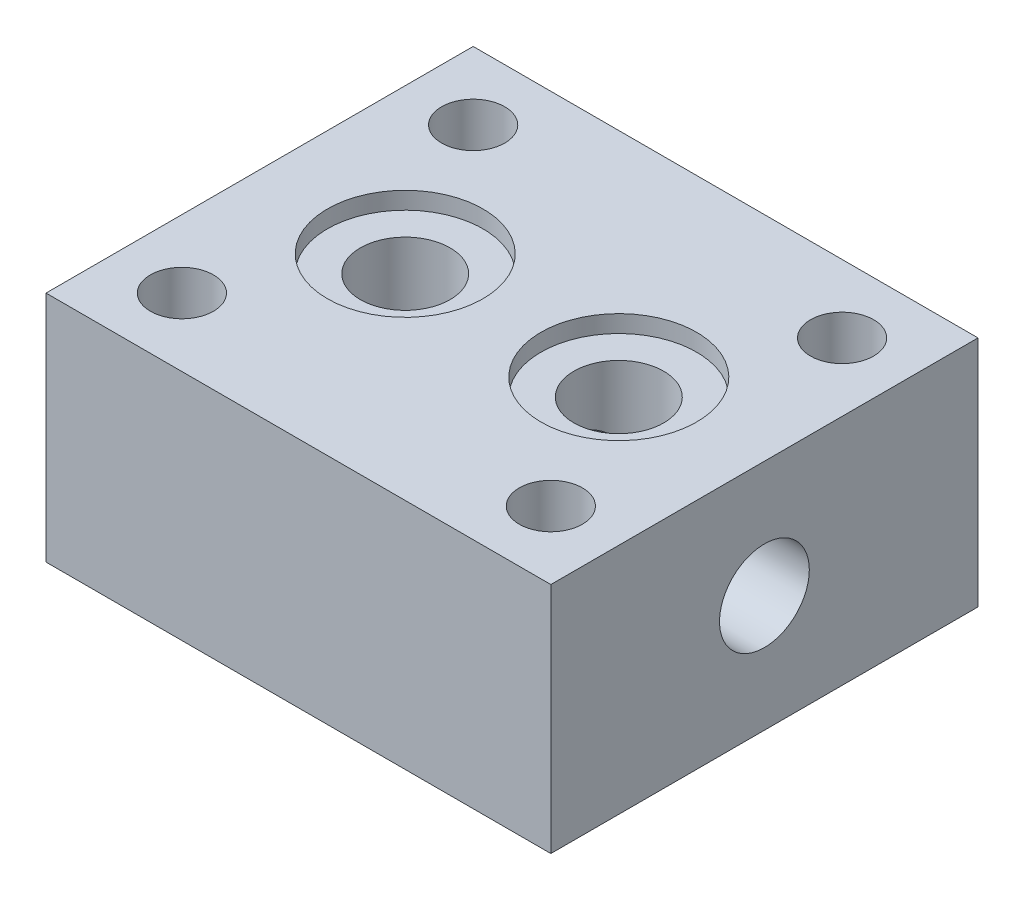
ISO-10303-21;
HEADER;
FILE_DESCRIPTION(('STEP AP214'),'2;1');
FILE_NAME('part.step','',(''),(''),'','','');
FILE_SCHEMA(('AUTOMOTIVE_DESIGN { 1 0 10303 214 1 1 1 1 }'));
ENDSEC;
DATA;
#1=APPLICATION_CONTEXT('core data for automotive mechanical design processes');
#2=APPLICATION_PROTOCOL_DEFINITION('international standard','automotive_design',2000,#1);
#3=PRODUCT_CONTEXT('',#1,'mechanical');
#4=PRODUCT('Part','Part','',(#3));
#5=PRODUCT_RELATED_PRODUCT_CATEGORY('part','',(#4));
#6=PRODUCT_DEFINITION_FORMATION('','',#4);
#7=PRODUCT_DEFINITION_CONTEXT('part definition',#1,'design');
#8=PRODUCT_DEFINITION('design','',#6,#7);
#9=PRODUCT_DEFINITION_SHAPE('','',#8);
#10=(LENGTH_UNIT() NAMED_UNIT(*) SI_UNIT(.MILLI.,.METRE.));
#11=(NAMED_UNIT(*) PLANE_ANGLE_UNIT() SI_UNIT($,.RADIAN.));
#12=(NAMED_UNIT(*) SI_UNIT($,.STERADIAN.) SOLID_ANGLE_UNIT());
#13=UNCERTAINTY_MEASURE_WITH_UNIT(LENGTH_MEASURE(1.E-05),#10,'distance_accuracy_value','');
#14=(GEOMETRIC_REPRESENTATION_CONTEXT(3) GLOBAL_UNCERTAINTY_ASSIGNED_CONTEXT((#13)) GLOBAL_UNIT_ASSIGNED_CONTEXT((#10,
#11,#12)) REPRESENTATION_CONTEXT('',''));
#15=CARTESIAN_POINT('',(0.,0.,0.));
#16=DIRECTION('',(0.,0.,1.));
#17=DIRECTION('',(1.,0.,0.));
#18=AXIS2_PLACEMENT_3D('',#15,#16,#17);
#19=CARTESIAN_POINT('',(17.4625,-9.525,0.));
#20=DIRECTION('',(0.,1.,0.));
#21=DIRECTION('',(0.,0.,1.));
#22=AXIS2_PLACEMENT_3D('',#19,#20,#21);
#23=CYLINDRICAL_SURFACE('',#22,7.3421875);
#24=CARTESIAN_POINT('',(17.4625,16.2306,0.));
#25=DIRECTION('',(0.,1.,0.));
#26=DIRECTION('',(0.,0.,1.));
#27=AXIS2_PLACEMENT_3D('',#24,#25,#26);
#28=CIRCLE('',#27,7.3421875);
#29=CARTESIAN_POINT('',(17.4625,16.2306,7.3421875));
#30=VERTEX_POINT('',#29);
#31=EDGE_CURVE('E151',#30,#30,#28,.F.);
#32=ORIENTED_EDGE('',*,*,#31,.F.);
#33=EDGE_LOOP('',(#32));
#34=FACE_BOUND('',#33,.T.);
#35=CARTESIAN_POINT('',(17.4625,0.,0.));
#36=DIRECTION('',(-0.707106781186547,0.707106781186548,0.));
#37=DIRECTION('',(0.707106781186547,0.707106781186548,0.));
#38=AXIS2_PLACEMENT_3D('',#35,#36,#37);
#39=ELLIPSE('',#38,10.3834211399862,7.3421875);
#40=CARTESIAN_POINT('',(17.4625,0.,-7.3421875));
#41=VERTEX_POINT('',#40);
#42=CARTESIAN_POINT('',(17.4625,0.,7.3421875));
#43=VERTEX_POINT('',#42);
#44=EDGE_CURVE('E63',#41,#43,#39,.F.);
#45=ORIENTED_EDGE('',*,*,#44,.T.);
#46=CARTESIAN_POINT('',(17.4625,0.,0.));
#47=DIRECTION('',(0.707106781186547,0.707106781186548,0.));
#48=DIRECTION('',(-0.707106781186547,0.707106781186548,0.));
#49=AXIS2_PLACEMENT_3D('',#46,#47,#48);
#50=ELLIPSE('',#49,10.3834211399862,7.3421875);
#51=EDGE_CURVE('E216',#43,#41,#50,.F.);
#52=ORIENTED_EDGE('',*,*,#51,.T.);
#53=EDGE_LOOP('',(#45,#52));
#54=FACE_BOUND('',#53,.T.);
#55=ADVANCED_FACE('F41',(#34,#54),#23,.F.);
#56=CARTESIAN_POINT('',(41.275,19.05,34.925));
#57=DIRECTION('',(-1.,0.,0.));
#58=DIRECTION('',(0.,0.,1.));
#59=AXIS2_PLACEMENT_3D('',#56,#57,#58);
#60=PLANE('',#59);
#61=CARTESIAN_POINT('',(41.275,0.,0.));
#62=DIRECTION('',(1.,0.,0.));
#63=DIRECTION('',(0.,0.,-1.));
#64=AXIS2_PLACEMENT_3D('',#61,#62,#63);
#65=CIRCLE('',#64,7.3421875);
#66=CARTESIAN_POINT('',(41.275,0.,-7.3421875));
#67=VERTEX_POINT('',#66);
#68=EDGE_CURVE('E119',#67,#67,#65,.T.);
#69=ORIENTED_EDGE('',*,*,#68,.F.);
#70=EDGE_LOOP('',(#69));
#71=FACE_BOUND('',#70,.T.);
#72=DIRECTION('',(0.,0.,-1.));
#73=VECTOR('',#72,1.);
#74=CARTESIAN_POINT('',(41.275,-19.05,34.925));
#75=LINE('',#74,#73);
#76=CARTESIAN_POINT('',(41.275,-19.05,34.925));
#77=VERTEX_POINT('',#76);
#78=CARTESIAN_POINT('',(41.275,-19.05,-34.925));
#79=VERTEX_POINT('',#78);
#80=EDGE_CURVE('E173',#77,#79,#75,.T.);
#81=ORIENTED_EDGE('',*,*,#80,.T.);
#82=DIRECTION('',(0.,-1.,0.));
#83=VECTOR('',#82,1.);
#84=CARTESIAN_POINT('',(41.275,19.05,-34.925));
#85=LINE('',#84,#83);
#86=CARTESIAN_POINT('',(41.275,19.05,-34.925));
#87=VERTEX_POINT('',#86);
#88=EDGE_CURVE('E202',#87,#79,#85,.T.);
#89=ORIENTED_EDGE('',*,*,#88,.F.);
#90=DIRECTION('',(0.,0.,-1.));
#91=VECTOR('',#90,1.);
#92=CARTESIAN_POINT('',(41.275,19.05,34.925));
#93=LINE('',#92,#91);
#94=CARTESIAN_POINT('',(41.275,19.05,34.925));
#95=VERTEX_POINT('',#94);
#96=EDGE_CURVE('E176',#95,#87,#93,.T.);
#97=ORIENTED_EDGE('',*,*,#96,.F.);
#98=DIRECTION('',(0.,-1.,0.));
#99=VECTOR('',#98,1.);
#100=CARTESIAN_POINT('',(41.275,19.05,34.925));
#101=LINE('',#100,#99);
#102=EDGE_CURVE('E186',#95,#77,#101,.T.);
#103=ORIENTED_EDGE('',*,*,#102,.T.);
#104=EDGE_LOOP('',(#81,#89,#97,#103));
#105=FACE_BOUND('',#104,.T.);
#106=ADVANCED_FACE('F43',(#71,#105),#60,.F.);
#107=CARTESIAN_POINT('',(-41.275,19.05,-34.925));
#108=DIRECTION('',(0.,0.,1.));
#109=DIRECTION('',(1.,0.,0.));
#110=AXIS2_PLACEMENT_3D('',#107,#108,#109);
#111=PLANE('',#110);
#112=DIRECTION('',(-1.,0.,0.));
#113=VECTOR('',#112,1.);
#114=CARTESIAN_POINT('',(-41.275,-19.05,-34.925));
#115=LINE('',#114,#113);
#116=CARTESIAN_POINT('',(-41.275,-19.05,-34.925));
#117=VERTEX_POINT('',#116);
#118=EDGE_CURVE('E189',#79,#117,#115,.T.);
#119=ORIENTED_EDGE('',*,*,#118,.T.);
#120=DIRECTION('',(0.,-1.,0.));
#121=VECTOR('',#120,1.);
#122=CARTESIAN_POINT('',(-41.275,19.05,-34.925));
#123=LINE('',#122,#121);
#124=CARTESIAN_POINT('',(-41.275,19.05,-34.925));
#125=VERTEX_POINT('',#124);
#126=EDGE_CURVE('E199',#125,#117,#123,.T.);
#127=ORIENTED_EDGE('',*,*,#126,.F.);
#128=DIRECTION('',(-1.,0.,0.));
#129=VECTOR('',#128,1.);
#130=CARTESIAN_POINT('',(-41.275,19.05,-34.925));
#131=LINE('',#130,#129);
#132=EDGE_CURVE('E179',#87,#125,#131,.T.);
#133=ORIENTED_EDGE('',*,*,#132,.F.);
#134=ORIENTED_EDGE('',*,*,#88,.T.);
#135=EDGE_LOOP('',(#119,#127,#133,#134));
#136=FACE_BOUND('',#135,.T.);
#137=ADVANCED_FACE('F251',(#136),#111,.F.);
#138=CARTESIAN_POINT('',(-41.275,19.05,34.925));
#139=DIRECTION('',(1.,0.,0.));
#140=DIRECTION('',(0.,0.,-1.));
#141=AXIS2_PLACEMENT_3D('',#138,#139,#140);
#142=PLANE('',#141);
#143=DIRECTION('',(0.,0.,1.));
#144=VECTOR('',#143,1.);
#145=CARTESIAN_POINT('',(-41.275,-19.05,34.925));
#146=LINE('',#145,#144);
#147=CARTESIAN_POINT('',(-41.275,-19.05,34.925));
#148=VERTEX_POINT('',#147);
#149=EDGE_CURVE('E191',#117,#148,#146,.T.);
#150=ORIENTED_EDGE('',*,*,#149,.T.);
#151=DIRECTION('',(0.,-1.,0.));
#152=VECTOR('',#151,1.);
#153=CARTESIAN_POINT('',(-41.275,19.05,34.925));
#154=LINE('',#153,#152);
#155=CARTESIAN_POINT('',(-41.275,19.05,34.925));
#156=VERTEX_POINT('',#155);
#157=EDGE_CURVE('E196',#156,#148,#154,.T.);
#158=ORIENTED_EDGE('',*,*,#157,.F.);
#159=DIRECTION('',(0.,0.,1.));
#160=VECTOR('',#159,1.);
#161=CARTESIAN_POINT('',(-41.275,19.05,34.925));
#162=LINE('',#161,#160);
#163=EDGE_CURVE('E182',#125,#156,#162,.T.);
#164=ORIENTED_EDGE('',*,*,#163,.F.);
#165=ORIENTED_EDGE('',*,*,#126,.T.);
#166=EDGE_LOOP('',(#150,#158,#164,#165));
#167=FACE_BOUND('',#166,.T.);
#168=ADVANCED_FACE('F288',(#167),#142,.F.);
#169=CARTESIAN_POINT('',(-41.275,19.05,34.925));
#170=DIRECTION('',(0.,0.,-1.));
#171=DIRECTION('',(-1.,0.,0.));
#172=AXIS2_PLACEMENT_3D('',#169,#170,#171);
#173=PLANE('',#172);
#174=DIRECTION('',(1.,0.,0.));
#175=VECTOR('',#174,1.);
#176=CARTESIAN_POINT('',(-41.275,-19.05,34.925));
#177=LINE('',#176,#175);
#178=EDGE_CURVE('E180',#148,#77,#177,.T.);
#179=ORIENTED_EDGE('',*,*,#178,.T.);
#180=ORIENTED_EDGE('',*,*,#102,.F.);
#181=DIRECTION('',(1.,0.,0.));
#182=VECTOR('',#181,1.);
#183=CARTESIAN_POINT('',(-41.275,19.05,34.925));
#184=LINE('',#183,#182);
#185=EDGE_CURVE('E184',#156,#95,#184,.T.);
#186=ORIENTED_EDGE('',*,*,#185,.F.);
#187=ORIENTED_EDGE('',*,*,#157,.T.);
#188=EDGE_LOOP('',(#179,#180,#186,#187));
#189=FACE_BOUND('',#188,.T.);
#190=ADVANCED_FACE('F281',(#189),#173,.F.);
#191=CARTESIAN_POINT('',(0.,19.05,0.));
#192=DIRECTION('',(0.,-1.,0.));
#193=DIRECTION('',(0.,0.,-1.));
#194=AXIS2_PLACEMENT_3D('',#191,#192,#193);
#195=PLANE('',#194);
#196=CARTESIAN_POINT('',(-17.4625,19.05,0.));
#197=DIRECTION('',(0.,1.,0.));
#198=DIRECTION('',(0.,0.,1.));
#199=AXIS2_PLACEMENT_3D('',#196,#197,#198);
#200=CIRCLE('',#199,12.7254);
#201=CARTESIAN_POINT('',(-17.4625,19.05,12.7254));
#202=VERTEX_POINT('',#201);
#203=EDGE_CURVE('E135',#202,#202,#200,.T.);
#204=ORIENTED_EDGE('',*,*,#203,.F.);
#205=EDGE_LOOP('',(#204));
#206=FACE_BOUND('',#205,.T.);
#207=CARTESIAN_POINT('',(17.4625,19.05,0.));
#208=DIRECTION('',(0.,1.,0.));
#209=DIRECTION('',(0.,0.,1.));
#210=AXIS2_PLACEMENT_3D('',#207,#208,#209);
#211=CIRCLE('',#210,12.7254);
#212=CARTESIAN_POINT('',(17.4625,19.05,12.7254));
#213=VERTEX_POINT('',#212);
#214=EDGE_CURVE('E138',#213,#213,#211,.T.);
#215=ORIENTED_EDGE('',*,*,#214,.F.);
#216=EDGE_LOOP('',(#215));
#217=FACE_BOUND('',#216,.T.);
#218=CARTESIAN_POINT('',(30.1625,19.05,23.8125));
#219=DIRECTION('',(0.,1.,0.));
#220=DIRECTION('',(0.,0.,1.));
#221=AXIS2_PLACEMENT_3D('',#218,#219,#220);
#222=CIRCLE('',#221,5.159375);
#223=CARTESIAN_POINT('',(30.1625,19.05,28.971875));
#224=VERTEX_POINT('',#223);
#225=EDGE_CURVE('E158',#224,#224,#222,.T.);
#226=ORIENTED_EDGE('',*,*,#225,.F.);
#227=EDGE_LOOP('',(#226));
#228=FACE_BOUND('',#227,.T.);
#229=CARTESIAN_POINT('',(-30.1625,19.05,-23.8125));
#230=DIRECTION('',(0.,1.,0.));
#231=DIRECTION('',(0.,0.,1.));
#232=AXIS2_PLACEMENT_3D('',#229,#230,#231);
#233=CIRCLE('',#232,5.159375);
#234=CARTESIAN_POINT('',(-30.1625,19.05,-18.653125));
#235=VERTEX_POINT('',#234);
#236=EDGE_CURVE('E165',#235,#235,#233,.T.);
#237=ORIENTED_EDGE('',*,*,#236,.F.);
#238=EDGE_LOOP('',(#237));
#239=FACE_BOUND('',#238,.T.);
#240=CARTESIAN_POINT('',(30.1625,19.05,-23.8125));
#241=DIRECTION('',(0.,1.,0.));
#242=DIRECTION('',(0.,0.,1.));
#243=AXIS2_PLACEMENT_3D('',#240,#241,#242);
#244=CIRCLE('',#243,5.159375);
#245=CARTESIAN_POINT('',(30.1625,19.05,-18.653125));
#246=VERTEX_POINT('',#245);
#247=EDGE_CURVE('E152',#246,#246,#244,.T.);
#248=ORIENTED_EDGE('',*,*,#247,.F.);
#249=EDGE_LOOP('',(#248));
#250=FACE_BOUND('',#249,.T.);
#251=CARTESIAN_POINT('',(-30.1625,19.05,23.8125));
#252=DIRECTION('',(0.,1.,0.));
#253=DIRECTION('',(0.,0.,1.));
#254=AXIS2_PLACEMENT_3D('',#251,#252,#253);
#255=CIRCLE('',#254,5.159375);
#256=CARTESIAN_POINT('',(-30.1625,19.05,28.971875));
#257=VERTEX_POINT('',#256);
#258=EDGE_CURVE('E161',#257,#257,#255,.T.);
#259=ORIENTED_EDGE('',*,*,#258,.F.);
#260=EDGE_LOOP('',(#259));
#261=FACE_BOUND('',#260,.T.);
#262=ORIENTED_EDGE('',*,*,#96,.T.);
#263=ORIENTED_EDGE('',*,*,#132,.T.);
#264=ORIENTED_EDGE('',*,*,#163,.T.);
#265=ORIENTED_EDGE('',*,*,#185,.T.);
#266=EDGE_LOOP('',(#262,#263,#264,#265));
#267=FACE_BOUND('',#266,.T.);
#268=ADVANCED_FACE('F278',(#206,#217,#228,#239,#250,#261,#267),#195,.F.);
#269=CARTESIAN_POINT('',(0.,-19.05,0.));
#270=DIRECTION('',(0.,-1.,0.));
#271=DIRECTION('',(0.,0.,-1.));
#272=AXIS2_PLACEMENT_3D('',#269,#270,#271);
#273=PLANE('',#272);
#274=CARTESIAN_POINT('',(30.1625,-19.05,23.8125));
#275=DIRECTION('',(0.,1.,0.));
#276=DIRECTION('',(0.,0.,1.));
#277=AXIS2_PLACEMENT_3D('',#274,#275,#276);
#278=CIRCLE('',#277,5.159375);
#279=CARTESIAN_POINT('',(30.1625,-19.05,28.971875));
#280=VERTEX_POINT('',#279);
#281=EDGE_CURVE('E162',#280,#280,#278,.T.);
#282=ORIENTED_EDGE('',*,*,#281,.T.);
#283=EDGE_LOOP('',(#282));
#284=FACE_BOUND('',#283,.T.);
#285=CARTESIAN_POINT('',(-30.1625,-19.05,-23.8125));
#286=DIRECTION('',(0.,1.,0.));
#287=DIRECTION('',(0.,0.,1.));
#288=AXIS2_PLACEMENT_3D('',#285,#286,#287);
#289=CIRCLE('',#288,5.159375);
#290=CARTESIAN_POINT('',(-30.1625,-19.05,-18.653125));
#291=VERTEX_POINT('',#290);
#292=EDGE_CURVE('E155',#291,#291,#289,.T.);
#293=ORIENTED_EDGE('',*,*,#292,.T.);
#294=EDGE_LOOP('',(#293));
#295=FACE_BOUND('',#294,.T.);
#296=CARTESIAN_POINT('',(30.1625,-19.05,-23.8125));
#297=DIRECTION('',(0.,1.,0.));
#298=DIRECTION('',(0.,0.,1.));
#299=AXIS2_PLACEMENT_3D('',#296,#297,#298);
#300=CIRCLE('',#299,5.159375);
#301=CARTESIAN_POINT('',(30.1625,-19.05,-18.653125));
#302=VERTEX_POINT('',#301);
#303=EDGE_CURVE('E147',#302,#302,#300,.T.);
#304=ORIENTED_EDGE('',*,*,#303,.T.);
#305=EDGE_LOOP('',(#304));
#306=FACE_BOUND('',#305,.T.);
#307=CARTESIAN_POINT('',(-30.1625,-19.05,23.8125));
#308=DIRECTION('',(0.,1.,0.));
#309=DIRECTION('',(0.,0.,1.));
#310=AXIS2_PLACEMENT_3D('',#307,#308,#309);
#311=CIRCLE('',#310,5.159375);
#312=CARTESIAN_POINT('',(-30.1625,-19.05,28.971875));
#313=VERTEX_POINT('',#312);
#314=EDGE_CURVE('E170',#313,#313,#311,.T.);
#315=ORIENTED_EDGE('',*,*,#314,.T.);
#316=EDGE_LOOP('',(#315));
#317=FACE_BOUND('',#316,.T.);
#318=ORIENTED_EDGE('',*,*,#80,.F.);
#319=ORIENTED_EDGE('',*,*,#178,.F.);
#320=ORIENTED_EDGE('',*,*,#149,.F.);
#321=ORIENTED_EDGE('',*,*,#118,.F.);
#322=EDGE_LOOP('',(#318,#319,#320,#321));
#323=FACE_BOUND('',#322,.T.);
#324=ADVANCED_FACE('F276',(#284,#295,#306,#317,#323),#273,.T.);
#325=CARTESIAN_POINT('',(-30.1625,-19.05,23.8125));
#326=DIRECTION('',(0.,1.,0.));
#327=DIRECTION('',(0.,0.,1.));
#328=AXIS2_PLACEMENT_3D('',#325,#326,#327);
#329=CYLINDRICAL_SURFACE('',#328,5.159375);
#330=ORIENTED_EDGE('',*,*,#314,.F.);
#331=EDGE_LOOP('',(#330));
#332=FACE_BOUND('',#331,.T.);
#333=ORIENTED_EDGE('',*,*,#258,.T.);
#334=EDGE_LOOP('',(#333));
#335=FACE_BOUND('',#334,.T.);
#336=ADVANCED_FACE('F264',(#332,#335),#329,.F.);
#337=CARTESIAN_POINT('',(30.1625,-19.05,-23.8125));
#338=DIRECTION('',(0.,1.,0.));
#339=DIRECTION('',(0.,0.,1.));
#340=AXIS2_PLACEMENT_3D('',#337,#338,#339);
#341=CYLINDRICAL_SURFACE('',#340,5.159375);
#342=ORIENTED_EDGE('',*,*,#303,.F.);
#343=EDGE_LOOP('',(#342));
#344=FACE_BOUND('',#343,.T.);
#345=ORIENTED_EDGE('',*,*,#247,.T.);
#346=EDGE_LOOP('',(#345));
#347=FACE_BOUND('',#346,.T.);
#348=ADVANCED_FACE('F260',(#344,#347),#341,.F.);
#349=CARTESIAN_POINT('',(-30.1625,-19.05,-23.8125));
#350=DIRECTION('',(0.,1.,0.));
#351=DIRECTION('',(0.,0.,1.));
#352=AXIS2_PLACEMENT_3D('',#349,#350,#351);
#353=CYLINDRICAL_SURFACE('',#352,5.159375);
#354=ORIENTED_EDGE('',*,*,#292,.F.);
#355=EDGE_LOOP('',(#354));
#356=FACE_BOUND('',#355,.T.);
#357=ORIENTED_EDGE('',*,*,#236,.T.);
#358=EDGE_LOOP('',(#357));
#359=FACE_BOUND('',#358,.T.);
#360=ADVANCED_FACE('F263',(#356,#359),#353,.F.);
#361=CARTESIAN_POINT('',(30.1625,-19.05,23.8125));
#362=DIRECTION('',(0.,1.,0.));
#363=DIRECTION('',(0.,0.,1.));
#364=AXIS2_PLACEMENT_3D('',#361,#362,#363);
#365=CYLINDRICAL_SURFACE('',#364,5.159375);
#366=ORIENTED_EDGE('',*,*,#281,.F.);
#367=EDGE_LOOP('',(#366));
#368=FACE_BOUND('',#367,.T.);
#369=ORIENTED_EDGE('',*,*,#225,.T.);
#370=EDGE_LOOP('',(#369));
#371=FACE_BOUND('',#370,.T.);
#372=ADVANCED_FACE('F266',(#368,#371),#365,.F.);
#373=CARTESIAN_POINT('',(-17.4625,16.2306,0.));
#374=DIRECTION('',(0.,1.,0.));
#375=DIRECTION('',(0.,0.,1.));
#376=AXIS2_PLACEMENT_3D('',#373,#374,#375);
#377=PLANE('',#376);
#378=CARTESIAN_POINT('',(-17.4625,16.2306,0.));
#379=DIRECTION('',(0.,1.,0.));
#380=DIRECTION('',(0.,0.,1.));
#381=AXIS2_PLACEMENT_3D('',#378,#379,#380);
#382=CIRCLE('',#381,12.7254);
#383=CARTESIAN_POINT('',(-17.4625,16.2306,12.7254));
#384=VERTEX_POINT('',#383);
#385=EDGE_CURVE('E131',#384,#384,#382,.T.);
#386=ORIENTED_EDGE('',*,*,#385,.T.);
#387=EDGE_LOOP('',(#386));
#388=FACE_BOUND('',#387,.T.);
#389=CARTESIAN_POINT('',(-17.4625,16.2306,0.));
#390=DIRECTION('',(0.,1.,0.));
#391=DIRECTION('',(0.,0.,1.));
#392=AXIS2_PLACEMENT_3D('',#389,#390,#391);
#393=CIRCLE('',#392,7.3421875);
#394=CARTESIAN_POINT('',(-17.4625,16.2306,7.3421875));
#395=VERTEX_POINT('',#394);
#396=EDGE_CURVE('E134',#395,#395,#393,.F.);
#397=ORIENTED_EDGE('',*,*,#396,.T.);
#398=EDGE_LOOP('',(#397));
#399=FACE_BOUND('',#398,.T.);
#400=ADVANCED_FACE('F269',(#388,#399),#377,.T.);
#401=CARTESIAN_POINT('',(-17.4625,16.2306,0.));
#402=DIRECTION('',(0.,1.,0.));
#403=DIRECTION('',(0.,0.,1.));
#404=AXIS2_PLACEMENT_3D('',#401,#402,#403);
#405=CYLINDRICAL_SURFACE('',#404,12.7254);
#406=ORIENTED_EDGE('',*,*,#385,.F.);
#407=EDGE_LOOP('',(#406));
#408=FACE_BOUND('',#407,.T.);
#409=ORIENTED_EDGE('',*,*,#203,.T.);
#410=EDGE_LOOP('',(#409));
#411=FACE_BOUND('',#410,.T.);
#412=ADVANCED_FACE('F372',(#408,#411),#405,.F.);
#413=CARTESIAN_POINT('',(17.4625,16.2306,0.));
#414=DIRECTION('',(0.,1.,0.));
#415=DIRECTION('',(0.,0.,1.));
#416=AXIS2_PLACEMENT_3D('',#413,#414,#415);
#417=PLANE('',#416);
#418=CARTESIAN_POINT('',(17.4625,16.2306,0.));
#419=DIRECTION('',(0.,1.,0.));
#420=DIRECTION('',(0.,0.,1.));
#421=AXIS2_PLACEMENT_3D('',#418,#419,#420);
#422=CIRCLE('',#421,12.7254);
#423=CARTESIAN_POINT('',(17.4625,16.2306,12.7254));
#424=VERTEX_POINT('',#423);
#425=EDGE_CURVE('E141',#424,#424,#422,.T.);
#426=ORIENTED_EDGE('',*,*,#425,.T.);
#427=EDGE_LOOP('',(#426));
#428=FACE_BOUND('',#427,.T.);
#429=ORIENTED_EDGE('',*,*,#31,.T.);
#430=EDGE_LOOP('',(#429));
#431=FACE_BOUND('',#430,.T.);
#432=ADVANCED_FACE('F381',(#428,#431),#417,.T.);
#433=CARTESIAN_POINT('',(17.4625,16.2306,0.));
#434=DIRECTION('',(0.,1.,0.));
#435=DIRECTION('',(0.,0.,1.));
#436=AXIS2_PLACEMENT_3D('',#433,#434,#435);
#437=CYLINDRICAL_SURFACE('',#436,12.7254);
#438=ORIENTED_EDGE('',*,*,#425,.F.);
#439=EDGE_LOOP('',(#438));
#440=FACE_BOUND('',#439,.T.);
#441=ORIENTED_EDGE('',*,*,#214,.T.);
#442=EDGE_LOOP('',(#441));
#443=FACE_BOUND('',#442,.T.);
#444=ADVANCED_FACE('F358',(#440,#443),#437,.F.);
#445=CARTESIAN_POINT('',(-17.4625,-9.525,0.));
#446=DIRECTION('',(0.,1.,0.));
#447=DIRECTION('',(0.,0.,1.));
#448=AXIS2_PLACEMENT_3D('',#445,#446,#447);
#449=PLANE('',#448);
#450=CARTESIAN_POINT('',(-17.4625,-9.525,0.));
#451=DIRECTION('',(0.,1.,0.));
#452=DIRECTION('',(0.,0.,1.));
#453=AXIS2_PLACEMENT_3D('',#450,#451,#452);
#454=CIRCLE('',#453,7.3421875);
#455=CARTESIAN_POINT('',(-17.4625,-9.525,7.3421875));
#456=VERTEX_POINT('',#455);
#457=EDGE_CURVE('E144',#456,#456,#454,.T.);
#458=ORIENTED_EDGE('',*,*,#457,.T.);
#459=EDGE_LOOP('',(#458));
#460=FACE_BOUND('',#459,.T.);
#461=ADVANCED_FACE('F356',(#460),#449,.T.);
#462=CARTESIAN_POINT('',(-17.4625,-9.525,0.));
#463=DIRECTION('',(0.,1.,0.));
#464=DIRECTION('',(0.,0.,1.));
#465=AXIS2_PLACEMENT_3D('',#462,#463,#464);
#466=CYLINDRICAL_SURFACE('',#465,7.3421875);
#467=CARTESIAN_POINT('',(-17.4625,0.,0.));
#468=DIRECTION('',(0.707106781186547,0.707106781186548,0.));
#469=DIRECTION('',(-0.707106781186547,0.707106781186548,0.));
#470=AXIS2_PLACEMENT_3D('',#467,#468,#469);
#471=ELLIPSE('',#470,10.3834211399862,7.3421875);
#472=CARTESIAN_POINT('',(-17.4625,0.,7.3421875));
#473=VERTEX_POINT('',#472);
#474=CARTESIAN_POINT('',(-17.4625,0.,-7.3421875));
#475=VERTEX_POINT('',#474);
#476=EDGE_CURVE('E114',#473,#475,#471,.T.);
#477=ORIENTED_EDGE('',*,*,#476,.T.);
#478=CARTESIAN_POINT('',(-17.4625,0.,0.));
#479=DIRECTION('',(-0.707106781186547,0.707106781186548,0.));
#480=DIRECTION('',(0.707106781186547,0.707106781186548,0.));
#481=AXIS2_PLACEMENT_3D('',#478,#479,#480);
#482=ELLIPSE('',#481,10.3834211399862,7.3421875);
#483=CARTESIAN_POINT('',(-19.05,-1.5875,-7.16851177268729));
#484=VERTEX_POINT('',#483);
#485=EDGE_CURVE('E56',#475,#484,#482,.T.);
#486=ORIENTED_EDGE('',*,*,#485,.T.);
#487=DIRECTION('',(0.,1.,0.));
#488=VECTOR('',#487,1.);
#489=CARTESIAN_POINT('',(-19.05,-9.525,-7.16851177268729));
#490=LINE('',#489,#488);
#491=CARTESIAN_POINT('',(-19.05,1.5875,-7.16851177268729));
#492=VERTEX_POINT('',#491);
#493=EDGE_CURVE('E11',#492,#484,#490,.F.);
#494=ORIENTED_EDGE('',*,*,#493,.F.);
#495=CARTESIAN_POINT('',(-17.4625,0.,0.));
#496=DIRECTION('',(0.707106781186547,0.707106781186548,0.));
#497=DIRECTION('',(-0.707106781186547,0.707106781186548,0.));
#498=AXIS2_PLACEMENT_3D('',#495,#496,#497);
#499=ELLIPSE('',#498,10.3834211399862,7.3421875);
#500=EDGE_CURVE('E105',#492,#475,#499,.F.);
#501=ORIENTED_EDGE('',*,*,#500,.T.);
#502=CARTESIAN_POINT('',(-17.4625,0.,0.));
#503=DIRECTION('',(-0.707106781186547,0.707106781186548,0.));
#504=DIRECTION('',(0.707106781186547,0.707106781186548,0.));
#505=AXIS2_PLACEMENT_3D('',#502,#503,#504);
#506=ELLIPSE('',#505,10.3834211399862,7.3421875);
#507=EDGE_CURVE('E127',#475,#473,#506,.F.);
#508=ORIENTED_EDGE('',*,*,#507,.T.);
#509=CARTESIAN_POINT('',(-19.05,1.5875,7.16851177268729));
#510=VERTEX_POINT('',#509);
#511=EDGE_CURVE('E113',#473,#510,#499,.F.);
#512=ORIENTED_EDGE('',*,*,#511,.T.);
#513=DIRECTION('',(0.,1.,0.));
#514=VECTOR('',#513,1.);
#515=CARTESIAN_POINT('',(-19.05,-9.525,7.16851177268729));
#516=LINE('',#515,#514);
#517=CARTESIAN_POINT('',(-19.05,-1.5875,7.16851177268729));
#518=VERTEX_POINT('',#517);
#519=EDGE_CURVE('E49',#518,#510,#516,.T.);
#520=ORIENTED_EDGE('',*,*,#519,.F.);
#521=EDGE_CURVE('E124',#518,#473,#482,.T.);
#522=ORIENTED_EDGE('',*,*,#521,.T.);
#523=EDGE_LOOP('',(#477,#486,#494,#501,#508,#512,#520,#522));
#524=FACE_BOUND('',#523,.T.);
#525=ORIENTED_EDGE('',*,*,#457,.F.);
#526=EDGE_LOOP('',(#525));
#527=FACE_BOUND('',#526,.T.);
#528=ORIENTED_EDGE('',*,*,#396,.F.);
#529=EDGE_LOOP('',(#528));
#530=FACE_BOUND('',#529,.T.);
#531=ADVANCED_FACE('F121',(#524,#527,#530),#466,.F.);
#532=CARTESIAN_POINT('',(-19.05,0.,0.));
#533=DIRECTION('',(1.,0.,0.));
#534=DIRECTION('',(0.,0.,-1.));
#535=AXIS2_PLACEMENT_3D('',#532,#533,#534);
#536=CYLINDRICAL_SURFACE('',#535,7.3421875);
#537=ORIENTED_EDGE('',*,*,#68,.T.);
#538=EDGE_LOOP('',(#537));
#539=FACE_BOUND('',#538,.T.);
#540=ORIENTED_EDGE('',*,*,#44,.F.);
#541=CARTESIAN_POINT('',(17.4625,0.,0.));
#542=DIRECTION('',(0.707106781186547,0.707106781186548,0.));
#543=DIRECTION('',(-0.707106781186547,0.707106781186548,0.));
#544=AXIS2_PLACEMENT_3D('',#541,#542,#543);
#545=ELLIPSE('',#544,10.3834211399862,7.3421875);
#546=EDGE_CURVE('E213',#43,#41,#545,.T.);
#547=ORIENTED_EDGE('',*,*,#546,.F.);
#548=EDGE_LOOP('',(#540,#547));
#549=FACE_BOUND('',#548,.T.);
#550=ADVANCED_FACE('F232',(#539,#549),#536,.F.);
#551=CARTESIAN_POINT('',(17.4625,-9.525,0.));
#552=DIRECTION('',(0.,1.,0.));
#553=DIRECTION('',(0.,0.,1.));
#554=AXIS2_PLACEMENT_3D('',#551,#552,#553);
#555=PLANE('',#554);
#556=CARTESIAN_POINT('',(17.4625,-9.525,0.));
#557=DIRECTION('',(0.,1.,0.));
#558=DIRECTION('',(0.,0.,1.));
#559=AXIS2_PLACEMENT_3D('',#556,#557,#558);
#560=CIRCLE('',#559,7.3421875);
#561=CARTESIAN_POINT('',(17.4625,-9.525,7.3421875));
#562=VERTEX_POINT('',#561);
#563=EDGE_CURVE('E148',#562,#562,#560,.T.);
#564=ORIENTED_EDGE('',*,*,#563,.T.);
#565=EDGE_LOOP('',(#564));
#566=FACE_BOUND('',#565,.T.);
#567=ADVANCED_FACE('F238',(#566),#555,.T.);
#568=CARTESIAN_POINT('',(17.4625,0.,0.));
#569=DIRECTION('',(-0.707106781186547,0.707106781186548,0.));
#570=DIRECTION('',(0.707106781186547,0.707106781186548,0.));
#571=AXIS2_PLACEMENT_3D('',#568,#569,#570);
#572=ELLIPSE('',#571,10.3834211399862,7.3421875);
#573=EDGE_CURVE('E210',#41,#43,#572,.T.);
#574=ORIENTED_EDGE('',*,*,#573,.T.);
#575=ORIENTED_EDGE('',*,*,#546,.T.);
#576=EDGE_LOOP('',(#574,#575));
#577=FACE_BOUND('',#576,.T.);
#578=ORIENTED_EDGE('',*,*,#563,.F.);
#579=EDGE_LOOP('',(#578));
#580=FACE_BOUND('',#579,.T.);
#581=ADVANCED_FACE('F229',(#577,#580),#23,.F.);
#582=ORIENTED_EDGE('',*,*,#573,.F.);
#583=ORIENTED_EDGE('',*,*,#51,.F.);
#584=EDGE_LOOP('',(#582,#583));
#585=FACE_BOUND('',#584,.T.);
#586=ORIENTED_EDGE('',*,*,#507,.F.);
#587=ORIENTED_EDGE('',*,*,#476,.F.);
#588=EDGE_LOOP('',(#586,#587));
#589=FACE_BOUND('',#588,.T.);
#590=ADVANCED_FACE('F227',(#585,#589),#536,.F.);
#591=CARTESIAN_POINT('',(-19.05,0.,0.));
#592=DIRECTION('',(1.,0.,0.));
#593=DIRECTION('',(0.,0.,-1.));
#594=AXIS2_PLACEMENT_3D('',#591,#592,#593);
#595=PLANE('',#594);
#596=ORIENTED_EDGE('',*,*,#519,.T.);
#597=CARTESIAN_POINT('',(-19.05,0.,0.));
#598=DIRECTION('',(1.,0.,0.));
#599=DIRECTION('',(0.,0.,-1.));
#600=AXIS2_PLACEMENT_3D('',#597,#598,#599);
#601=CIRCLE('',#600,7.3421875);
#602=EDGE_CURVE('E118',#510,#518,#601,.T.);
#603=ORIENTED_EDGE('',*,*,#602,.T.);
#604=EDGE_LOOP('',(#596,#603));
#605=FACE_BOUND('',#604,.T.);
#606=ADVANCED_FACE('F220',(#605),#595,.T.);
#607=ORIENTED_EDGE('',*,*,#521,.F.);
#608=ORIENTED_EDGE('',*,*,#602,.F.);
#609=ORIENTED_EDGE('',*,*,#511,.F.);
#610=EDGE_LOOP('',(#607,#608,#609));
#611=FACE_BOUND('',#610,.T.);
#612=ADVANCED_FACE('F225',(#611),#536,.F.);
#613=ORIENTED_EDGE('',*,*,#493,.T.);
#614=EDGE_CURVE('E108',#484,#492,#601,.T.);
#615=ORIENTED_EDGE('',*,*,#614,.T.);
#616=EDGE_LOOP('',(#613,#615));
#617=FACE_BOUND('',#616,.T.);
#618=ADVANCED_FACE('F117',(#617),#595,.T.);
#619=ORIENTED_EDGE('',*,*,#614,.F.);
#620=ORIENTED_EDGE('',*,*,#485,.F.);
#621=ORIENTED_EDGE('',*,*,#500,.F.);
#622=EDGE_LOOP('',(#619,#620,#621));
#623=FACE_BOUND('',#622,.T.);
#624=ADVANCED_FACE('F107',(#623),#536,.F.);
#625=CLOSED_SHELL('',(#55,#106,#137,#168,#190,#268,#324,#336,#348,#360,#372,#400,#412,#432,#444,
#461,#531,#550,#567,#581,#590,#606,#612,#618,#624));
#626=MANIFOLD_SOLID_BREP('B2',#625);
#627=ADVANCED_BREP_SHAPE_REPRESENTATION('',(#18,#626),#14);
#628=SHAPE_DEFINITION_REPRESENTATION(#9,#627);
ENDSEC;
END-ISO-10303-21;
